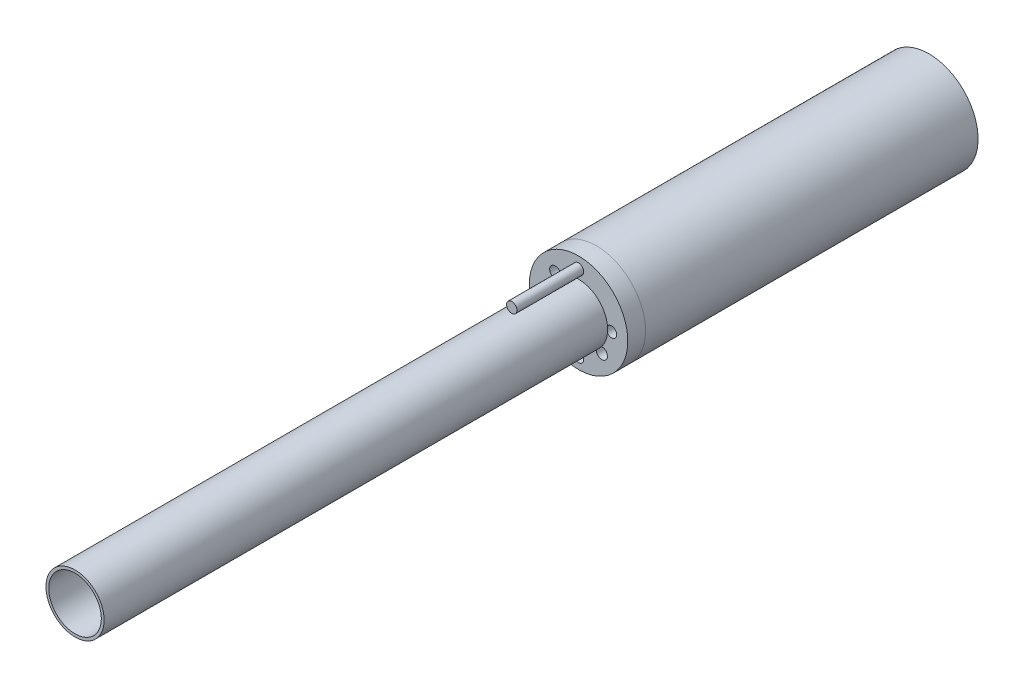
ISO-10303-21;
HEADER;
FILE_DESCRIPTION(('STEP AP214'),'2;1');
FILE_NAME('part.step','',(''),(''),'','','');
FILE_SCHEMA(('AUTOMOTIVE_DESIGN { 1 0 10303 214 1 1 1 1 }'));
ENDSEC;
DATA;
#1=APPLICATION_CONTEXT('core data for automotive mechanical design processes');
#2=APPLICATION_PROTOCOL_DEFINITION('international standard','automotive_design',2000,#1);
#3=PRODUCT_CONTEXT('',#1,'mechanical');
#4=PRODUCT('Part','Part','',(#3));
#5=PRODUCT_RELATED_PRODUCT_CATEGORY('part','',(#4));
#6=PRODUCT_DEFINITION_FORMATION('','',#4);
#7=PRODUCT_DEFINITION_CONTEXT('part definition',#1,'design');
#8=PRODUCT_DEFINITION('design','',#6,#7);
#9=PRODUCT_DEFINITION_SHAPE('','',#8);
#10=(LENGTH_UNIT() NAMED_UNIT(*) SI_UNIT(.MILLI.,.METRE.));
#11=(NAMED_UNIT(*) PLANE_ANGLE_UNIT() SI_UNIT($,.RADIAN.));
#12=(NAMED_UNIT(*) SI_UNIT($,.STERADIAN.) SOLID_ANGLE_UNIT());
#13=UNCERTAINTY_MEASURE_WITH_UNIT(LENGTH_MEASURE(1.E-05),#10,'distance_accuracy_value','');
#14=(GEOMETRIC_REPRESENTATION_CONTEXT(3) GLOBAL_UNCERTAINTY_ASSIGNED_CONTEXT((#13)) GLOBAL_UNIT_ASSIGNED_CONTEXT((#10,
#11,#12)) REPRESENTATION_CONTEXT('',''));
#15=CARTESIAN_POINT('',(0.,0.,0.));
#16=DIRECTION('',(0.,0.,1.));
#17=DIRECTION('',(1.,0.,0.));
#18=AXIS2_PLACEMENT_3D('',#15,#16,#17);
#19=CARTESIAN_POINT('',(0.,0.,3.175));
#20=DIRECTION('',(0.,0.,1.));
#21=DIRECTION('',(1.,0.,0.));
#22=AXIS2_PLACEMENT_3D('',#19,#20,#21);
#23=CYLINDRICAL_SURFACE('',#22,4.7);
#24=CARTESIAN_POINT('',(0.,0.,3.175));
#25=DIRECTION('',(0.,0.,1.));
#26=DIRECTION('',(1.,0.,0.));
#27=AXIS2_PLACEMENT_3D('',#24,#25,#26);
#28=CIRCLE('',#27,4.7);
#29=CARTESIAN_POINT('',(4.7,0.,3.175));
#30=VERTEX_POINT('',#29);
#31=EDGE_CURVE('P0_E44',#30,#30,#28,.T.);
#32=ORIENTED_EDGE('',*,*,#31,.F.);
#33=EDGE_LOOP('',(#32));
#34=FACE_BOUND('',#33,.T.);
#35=CARTESIAN_POINT('',(0.,0.,93.175));
#36=DIRECTION('',(0.,0.,1.));
#37=DIRECTION('',(1.,0.,0.));
#38=AXIS2_PLACEMENT_3D('',#35,#36,#37);
#39=CIRCLE('',#38,4.7);
#40=CARTESIAN_POINT('',(4.7,0.,93.175));
#41=VERTEX_POINT('',#40);
#42=EDGE_CURVE('P0_E52',#41,#41,#39,.T.);
#43=ORIENTED_EDGE('',*,*,#42,.T.);
#44=EDGE_LOOP('',(#43));
#45=FACE_BOUND('',#44,.T.);
#46=ADVANCED_FACE('P0_F38',(#34,#45),#23,.F.);
#47=CARTESIAN_POINT('',(0.,0.,3.175));
#48=DIRECTION('',(0.,0.,1.));
#49=DIRECTION('',(1.,0.,0.));
#50=AXIS2_PLACEMENT_3D('',#47,#48,#49);
#51=CYLINDRICAL_SURFACE('',#50,5.2);
#52=CARTESIAN_POINT('',(0.,0.,3.175));
#53=DIRECTION('',(0.,0.,1.));
#54=DIRECTION('',(1.,0.,0.));
#55=AXIS2_PLACEMENT_3D('',#52,#53,#54);
#56=CIRCLE('',#55,5.2);
#57=CARTESIAN_POINT('',(5.2,0.,3.175));
#58=VERTEX_POINT('',#57);
#59=EDGE_CURVE('P0_E10',#58,#58,#56,.T.);
#60=ORIENTED_EDGE('',*,*,#59,.T.);
#61=EDGE_LOOP('',(#60));
#62=FACE_BOUND('',#61,.T.);
#63=CARTESIAN_POINT('',(0.,0.,93.175));
#64=DIRECTION('',(0.,0.,1.));
#65=DIRECTION('',(1.,0.,0.));
#66=AXIS2_PLACEMENT_3D('',#63,#64,#65);
#67=CIRCLE('',#66,5.2);
#68=CARTESIAN_POINT('',(5.2,0.,93.175));
#69=VERTEX_POINT('',#68);
#70=EDGE_CURVE('P0_E48',#69,#69,#67,.T.);
#71=ORIENTED_EDGE('',*,*,#70,.F.);
#72=EDGE_LOOP('',(#71));
#73=FACE_BOUND('',#72,.T.);
#74=ADVANCED_FACE('P0_F66',(#62,#73),#51,.T.);
#75=CARTESIAN_POINT('',(0.,0.,3.175));
#76=DIRECTION('',(0.,0.,1.));
#77=DIRECTION('',(1.,0.,0.));
#78=AXIS2_PLACEMENT_3D('',#75,#76,#77);
#79=PLANE('',#78);
#80=ORIENTED_EDGE('',*,*,#31,.T.);
#81=EDGE_LOOP('',(#80));
#82=FACE_BOUND('',#81,.T.);
#83=ORIENTED_EDGE('',*,*,#59,.F.);
#84=EDGE_LOOP('',(#83));
#85=FACE_BOUND('',#84,.T.);
#86=ADVANCED_FACE('P0_F62',(#82,#85),#79,.F.);
#87=CARTESIAN_POINT('',(0.,0.,93.175));
#88=DIRECTION('',(0.,0.,1.));
#89=DIRECTION('',(1.,0.,0.));
#90=AXIS2_PLACEMENT_3D('',#87,#88,#89);
#91=PLANE('',#90);
#92=ORIENTED_EDGE('',*,*,#42,.F.);
#93=EDGE_LOOP('',(#92));
#94=FACE_BOUND('',#93,.T.);
#95=ORIENTED_EDGE('',*,*,#70,.T.);
#96=EDGE_LOOP('',(#95));
#97=FACE_BOUND('',#96,.T.);
#98=ADVANCED_FACE('P0_F59',(#94,#97),#91,.T.);
#99=CLOSED_SHELL('',(#46,#74,#86,#98));
#100=MANIFOLD_SOLID_BREP('P0_B2',#99);
#101=CARTESIAN_POINT('',(0.,0.,3.175));
#102=DIRECTION('',(0.,0.,1.));
#103=DIRECTION('',(-1.,0.,0.));
#104=AXIS2_PLACEMENT_3D('',#101,#102,#103);
#105=CYLINDRICAL_SURFACE('',#104,4.5);
#106=CARTESIAN_POINT('',(0.,0.,13.175));
#107=DIRECTION('',(0.,0.,1.));
#108=DIRECTION('',(-1.,0.,0.));
#109=AXIS2_PLACEMENT_3D('',#106,#107,#108);
#110=CIRCLE('',#109,4.5);
#111=CARTESIAN_POINT('',(4.5,0.,13.175));
#112=VERTEX_POINT('',#111);
#113=EDGE_CURVE('P1_E27',#112,#112,#110,.T.);
#114=ORIENTED_EDGE('',*,*,#113,.F.);
#115=DIRECTION('',(0.,0.,-1.));
#116=VECTOR('',#115,1.);
#117=CARTESIAN_POINT('',(4.5,0.,3.175));
#118=LINE('',#117,#116);
#119=CARTESIAN_POINT('',(4.5,0.,3.175));
#120=VERTEX_POINT('',#119);
#121=EDGE_CURVE('P1_E11',#112,#120,#118,.T.);
#122=ORIENTED_EDGE('',*,*,#121,.T.);
#123=CARTESIAN_POINT('',(0.,0.,3.175));
#124=DIRECTION('',(0.,0.,-1.));
#125=DIRECTION('',(-1.,0.,0.));
#126=AXIS2_PLACEMENT_3D('',#123,#124,#125);
#127=CIRCLE('',#126,4.5);
#128=EDGE_CURVE('P1_E120',#120,#120,#127,.T.);
#129=ORIENTED_EDGE('',*,*,#128,.F.);
#130=ORIENTED_EDGE('',*,*,#121,.F.);
#131=EDGE_LOOP('',(#114,#122,#129,#130));
#132=FACE_BOUND('',#131,.T.);
#133=ADVANCED_FACE('P1_F16',(#132),#105,.T.);
#134=CARTESIAN_POINT('',(0.,0.,13.175));
#135=DIRECTION('',(0.,0.,1.));
#136=DIRECTION('',(1.,0.,0.));
#137=AXIS2_PLACEMENT_3D('',#134,#135,#136);
#138=PLANE('',#137);
#139=ORIENTED_EDGE('',*,*,#113,.T.);
#140=EDGE_LOOP('',(#139));
#141=FACE_BOUND('',#140,.T.);
#142=ADVANCED_FACE('P1_F229',(#141),#138,.T.);
#143=CARTESIAN_POINT('',(4.16683884017609,-4.16683884017609,0.));
#144=DIRECTION('',(0.,0.,1.));
#145=DIRECTION('',(1.,0.,0.));
#146=AXIS2_PLACEMENT_3D('',#143,#144,#145);
#147=CYLINDRICAL_SURFACE('',#146,1.);
#148=CARTESIAN_POINT('',(4.16683884017609,-4.16683884017609,3.175));
#149=DIRECTION('',(0.,0.,-1.));
#150=DIRECTION('',(1.,0.,0.));
#151=AXIS2_PLACEMENT_3D('',#148,#149,#150);
#152=CIRCLE('',#151,1.);
#153=CARTESIAN_POINT('',(3.16683884017609,-4.16683884017609,3.175));
#154=VERTEX_POINT('',#153);
#155=EDGE_CURVE('P1_E92',#154,#154,#152,.T.);
#156=ORIENTED_EDGE('',*,*,#155,.F.);
#157=DIRECTION('',(0.,0.,-1.));
#158=VECTOR('',#157,1.);
#159=CARTESIAN_POINT('',(3.16683884017609,-4.16683884017609,0.));
#160=LINE('',#159,#158);
#161=CARTESIAN_POINT('',(3.16683884017609,-4.16683884017609,0.));
#162=VERTEX_POINT('',#161);
#163=EDGE_CURVE('P1_E87',#154,#162,#160,.T.);
#164=ORIENTED_EDGE('',*,*,#163,.T.);
#165=CARTESIAN_POINT('',(4.16683884017609,-4.16683884017609,0.));
#166=DIRECTION('',(0.,0.,-1.));
#167=DIRECTION('',(1.,0.,0.));
#168=AXIS2_PLACEMENT_3D('',#165,#166,#167);
#169=CIRCLE('',#168,1.);
#170=EDGE_CURVE('P1_E81',#162,#162,#169,.T.);
#171=ORIENTED_EDGE('',*,*,#170,.T.);
#172=ORIENTED_EDGE('',*,*,#163,.F.);
#173=EDGE_LOOP('',(#156,#164,#171,#172));
#174=FACE_BOUND('',#173,.T.);
#175=ADVANCED_FACE('P1_F90',(#174),#147,.F.);
#176=CARTESIAN_POINT('',(-4.16683884017609,4.16683884017609,0.));
#177=DIRECTION('',(0.,0.,1.));
#178=DIRECTION('',(1.,0.,0.));
#179=AXIS2_PLACEMENT_3D('',#176,#177,#178);
#180=CYLINDRICAL_SURFACE('',#179,1.);
#181=CARTESIAN_POINT('',(-4.16683884017609,4.16683884017609,3.175));
#182=DIRECTION('',(0.,0.,-1.));
#183=DIRECTION('',(1.,0.,0.));
#184=AXIS2_PLACEMENT_3D('',#181,#182,#183);
#185=CIRCLE('',#184,1.);
#186=CARTESIAN_POINT('',(-5.16683884017609,4.16683884017609,3.175));
#187=VERTEX_POINT('',#186);
#188=EDGE_CURVE('P1_E111',#187,#187,#185,.T.);
#189=ORIENTED_EDGE('',*,*,#188,.F.);
#190=DIRECTION('',(0.,0.,-1.));
#191=VECTOR('',#190,1.);
#192=CARTESIAN_POINT('',(-5.16683884017609,4.16683884017609,0.));
#193=LINE('',#192,#191);
#194=CARTESIAN_POINT('',(-5.16683884017609,4.16683884017609,0.));
#195=VERTEX_POINT('',#194);
#196=EDGE_CURVE('P1_E88',#187,#195,#193,.T.);
#197=ORIENTED_EDGE('',*,*,#196,.T.);
#198=CARTESIAN_POINT('',(-4.16683884017609,4.16683884017609,0.));
#199=DIRECTION('',(0.,0.,-1.));
#200=DIRECTION('',(1.,0.,0.));
#201=AXIS2_PLACEMENT_3D('',#198,#199,#200);
#202=CIRCLE('',#201,1.);
#203=EDGE_CURVE('P1_E129',#195,#195,#202,.T.);
#204=ORIENTED_EDGE('',*,*,#203,.T.);
#205=ORIENTED_EDGE('',*,*,#196,.F.);
#206=EDGE_LOOP('',(#189,#197,#204,#205));
#207=FACE_BOUND('',#206,.T.);
#208=ADVANCED_FACE('P1_F228',(#207),#180,.F.);
#209=CARTESIAN_POINT('',(5.8928,0.,0.));
#210=DIRECTION('',(0.,0.,1.));
#211=DIRECTION('',(1.,0.,0.));
#212=AXIS2_PLACEMENT_3D('',#209,#210,#211);
#213=CYLINDRICAL_SURFACE('',#212,0.927);
#214=CARTESIAN_POINT('',(5.8928,0.,3.175));
#215=DIRECTION('',(0.,0.,-1.));
#216=DIRECTION('',(1.,0.,0.));
#217=AXIS2_PLACEMENT_3D('',#214,#215,#216);
#218=CIRCLE('',#217,0.927);
#219=CARTESIAN_POINT('',(4.9658,0.,3.175));
#220=VERTEX_POINT('',#219);
#221=EDGE_CURVE('P1_E115',#220,#220,#218,.T.);
#222=ORIENTED_EDGE('',*,*,#221,.F.);
#223=DIRECTION('',(0.,0.,-1.));
#224=VECTOR('',#223,1.);
#225=CARTESIAN_POINT('',(4.9658,0.,0.));
#226=LINE('',#225,#224);
#227=CARTESIAN_POINT('',(4.9658,0.,0.));
#228=VERTEX_POINT('',#227);
#229=EDGE_CURVE('P1_E103',#220,#228,#226,.T.);
#230=ORIENTED_EDGE('',*,*,#229,.T.);
#231=CARTESIAN_POINT('',(5.8928,0.,0.));
#232=DIRECTION('',(0.,0.,-1.));
#233=DIRECTION('',(1.,0.,0.));
#234=AXIS2_PLACEMENT_3D('',#231,#232,#233);
#235=CIRCLE('',#234,0.927);
#236=EDGE_CURVE('P1_E100',#228,#228,#235,.T.);
#237=ORIENTED_EDGE('',*,*,#236,.T.);
#238=ORIENTED_EDGE('',*,*,#229,.F.);
#239=EDGE_LOOP('',(#222,#230,#237,#238));
#240=FACE_BOUND('',#239,.T.);
#241=ADVANCED_FACE('P1_F239',(#240),#213,.F.);
#242=CARTESIAN_POINT('',(-5.8928,0.,0.));
#243=DIRECTION('',(0.,0.,1.));
#244=DIRECTION('',(1.,0.,0.));
#245=AXIS2_PLACEMENT_3D('',#242,#243,#244);
#246=CYLINDRICAL_SURFACE('',#245,0.927);
#247=CARTESIAN_POINT('',(-5.8928,0.,3.175));
#248=DIRECTION('',(0.,0.,-1.));
#249=DIRECTION('',(1.,0.,0.));
#250=AXIS2_PLACEMENT_3D('',#247,#248,#249);
#251=CIRCLE('',#250,0.927);
#252=CARTESIAN_POINT('',(-6.8198,0.,3.175));
#253=VERTEX_POINT('',#252);
#254=EDGE_CURVE('P1_E135',#253,#253,#251,.T.);
#255=ORIENTED_EDGE('',*,*,#254,.F.);
#256=DIRECTION('',(0.,0.,-1.));
#257=VECTOR('',#256,1.);
#258=CARTESIAN_POINT('',(-6.8198,0.,0.));
#259=LINE('',#258,#257);
#260=CARTESIAN_POINT('',(-6.8198,0.,0.));
#261=VERTEX_POINT('',#260);
#262=EDGE_CURVE('P1_E104',#253,#261,#259,.T.);
#263=ORIENTED_EDGE('',*,*,#262,.T.);
#264=CARTESIAN_POINT('',(-5.8928,0.,0.));
#265=DIRECTION('',(0.,0.,-1.));
#266=DIRECTION('',(1.,0.,0.));
#267=AXIS2_PLACEMENT_3D('',#264,#265,#266);
#268=CIRCLE('',#267,0.927);
#269=EDGE_CURVE('P1_E131',#261,#261,#268,.T.);
#270=ORIENTED_EDGE('',*,*,#269,.T.);
#271=ORIENTED_EDGE('',*,*,#262,.F.);
#272=EDGE_LOOP('',(#255,#263,#270,#271));
#273=FACE_BOUND('',#272,.T.);
#274=ADVANCED_FACE('P1_F18',(#273),#246,.F.);
#275=CARTESIAN_POINT('',(0.,-6.7945,0.));
#276=DIRECTION('',(0.,0.,1.));
#277=DIRECTION('',(1.,0.,0.));
#278=AXIS2_PLACEMENT_3D('',#275,#276,#277);
#279=CYLINDRICAL_SURFACE('',#278,0.927);
#280=CARTESIAN_POINT('',(0.,-6.7945,3.175));
#281=DIRECTION('',(0.,0.,-1.));
#282=DIRECTION('',(1.,0.,0.));
#283=AXIS2_PLACEMENT_3D('',#280,#281,#282);
#284=CIRCLE('',#283,0.927);
#285=CARTESIAN_POINT('',(-0.927,-6.7945,3.175));
#286=VERTEX_POINT('',#285);
#287=EDGE_CURVE('P1_E121',#286,#286,#284,.T.);
#288=ORIENTED_EDGE('',*,*,#287,.F.);
#289=DIRECTION('',(0.,0.,-1.));
#290=VECTOR('',#289,1.);
#291=CARTESIAN_POINT('',(-0.927,-6.7945,0.));
#292=LINE('',#291,#290);
#293=CARTESIAN_POINT('',(-0.927,-6.7945,0.));
#294=VERTEX_POINT('',#293);
#295=EDGE_CURVE('P1_E20',#286,#294,#292,.T.);
#296=ORIENTED_EDGE('',*,*,#295,.T.);
#297=CARTESIAN_POINT('',(0.,-6.7945,0.));
#298=DIRECTION('',(0.,0.,-1.));
#299=DIRECTION('',(1.,0.,0.));
#300=AXIS2_PLACEMENT_3D('',#297,#298,#299);
#301=CIRCLE('',#300,0.927);
#302=EDGE_CURVE('P1_E145',#294,#294,#301,.T.);
#303=ORIENTED_EDGE('',*,*,#302,.T.);
#304=ORIENTED_EDGE('',*,*,#295,.F.);
#305=EDGE_LOOP('',(#288,#296,#303,#304));
#306=FACE_BOUND('',#305,.T.);
#307=ADVANCED_FACE('P1_F195',(#306),#279,.F.);
#308=CARTESIAN_POINT('',(0.,6.7945,0.));
#309=DIRECTION('',(0.,0.,1.));
#310=DIRECTION('',(1.,0.,0.));
#311=AXIS2_PLACEMENT_3D('',#308,#309,#310);
#312=CYLINDRICAL_SURFACE('',#311,0.927);
#313=CARTESIAN_POINT('',(0.,6.7945,3.175));
#314=DIRECTION('',(0.,0.,-1.));
#315=DIRECTION('',(1.,0.,0.));
#316=AXIS2_PLACEMENT_3D('',#313,#314,#315);
#317=CIRCLE('',#316,0.927);
#318=CARTESIAN_POINT('',(-0.927,6.7945,3.175));
#319=VERTEX_POINT('',#318);
#320=EDGE_CURVE('P1_E116',#319,#319,#317,.T.);
#321=ORIENTED_EDGE('',*,*,#320,.F.);
#322=DIRECTION('',(0.,0.,-1.));
#323=VECTOR('',#322,1.);
#324=CARTESIAN_POINT('',(-0.927,6.7945,0.));
#325=LINE('',#324,#323);
#326=CARTESIAN_POINT('',(-0.927,6.7945,0.));
#327=VERTEX_POINT('',#326);
#328=EDGE_CURVE('P1_E108',#319,#327,#325,.T.);
#329=ORIENTED_EDGE('',*,*,#328,.T.);
#330=CARTESIAN_POINT('',(0.,6.7945,0.));
#331=DIRECTION('',(0.,0.,-1.));
#332=DIRECTION('',(1.,0.,0.));
#333=AXIS2_PLACEMENT_3D('',#330,#331,#332);
#334=CIRCLE('',#333,0.927);
#335=EDGE_CURVE('P1_E105',#327,#327,#334,.T.);
#336=ORIENTED_EDGE('',*,*,#335,.T.);
#337=ORIENTED_EDGE('',*,*,#328,.F.);
#338=EDGE_LOOP('',(#321,#329,#336,#337));
#339=FACE_BOUND('',#338,.T.);
#340=ADVANCED_FACE('P1_F206',(#339),#312,.F.);
#341=CARTESIAN_POINT('',(0.,0.,0.));
#342=DIRECTION('',(0.,0.,1.));
#343=DIRECTION('',(1.,0.,0.));
#344=AXIS2_PLACEMENT_3D('',#341,#342,#343);
#345=CYLINDRICAL_SURFACE('',#344,8.8011);
#346=CARTESIAN_POINT('',(0.,0.,3.175));
#347=DIRECTION('',(0.,0.,1.));
#348=DIRECTION('',(1.,0.,0.));
#349=AXIS2_PLACEMENT_3D('',#346,#347,#348);
#350=CIRCLE('',#349,8.8011);
#351=CARTESIAN_POINT('',(-8.8011,0.,3.175));
#352=VERTEX_POINT('',#351);
#353=EDGE_CURVE('P1_E122',#352,#352,#350,.T.);
#354=ORIENTED_EDGE('',*,*,#353,.F.);
#355=DIRECTION('',(0.,0.,-1.));
#356=VECTOR('',#355,1.);
#357=CARTESIAN_POINT('',(-8.8011,0.,0.));
#358=LINE('',#357,#356);
#359=CARTESIAN_POINT('',(-8.8011,0.,0.));
#360=VERTEX_POINT('',#359);
#361=EDGE_CURVE('P1_E109',#352,#360,#358,.T.);
#362=ORIENTED_EDGE('',*,*,#361,.T.);
#363=CARTESIAN_POINT('',(0.,0.,0.));
#364=DIRECTION('',(0.,0.,1.));
#365=DIRECTION('',(1.,0.,0.));
#366=AXIS2_PLACEMENT_3D('',#363,#364,#365);
#367=CIRCLE('',#366,8.8011);
#368=EDGE_CURVE('P1_E126',#360,#360,#367,.T.);
#369=ORIENTED_EDGE('',*,*,#368,.T.);
#370=ORIENTED_EDGE('',*,*,#361,.F.);
#371=EDGE_LOOP('',(#354,#362,#369,#370));
#372=FACE_BOUND('',#371,.T.);
#373=ADVANCED_FACE('P1_F200',(#372),#345,.T.);
#374=CARTESIAN_POINT('',(0.,0.,3.175));
#375=DIRECTION('',(0.,0.,1.));
#376=DIRECTION('',(1.,0.,0.));
#377=AXIS2_PLACEMENT_3D('',#374,#375,#376);
#378=PLANE('',#377);
#379=ORIENTED_EDGE('',*,*,#353,.T.);
#380=EDGE_LOOP('',(#379));
#381=FACE_BOUND('',#380,.T.);
#382=ORIENTED_EDGE('',*,*,#128,.T.);
#383=EDGE_LOOP('',(#382));
#384=FACE_BOUND('',#383,.T.);
#385=ORIENTED_EDGE('',*,*,#320,.T.);
#386=EDGE_LOOP('',(#385));
#387=FACE_BOUND('',#386,.T.);
#388=ORIENTED_EDGE('',*,*,#287,.T.);
#389=EDGE_LOOP('',(#388));
#390=FACE_BOUND('',#389,.T.);
#391=ORIENTED_EDGE('',*,*,#254,.T.);
#392=EDGE_LOOP('',(#391));
#393=FACE_BOUND('',#392,.T.);
#394=ORIENTED_EDGE('',*,*,#221,.T.);
#395=EDGE_LOOP('',(#394));
#396=FACE_BOUND('',#395,.T.);
#397=ORIENTED_EDGE('',*,*,#188,.T.);
#398=EDGE_LOOP('',(#397));
#399=FACE_BOUND('',#398,.T.);
#400=ORIENTED_EDGE('',*,*,#155,.T.);
#401=EDGE_LOOP('',(#400));
#402=FACE_BOUND('',#401,.T.);
#403=ADVANCED_FACE('P1_F205',(#381,#384,#387,#390,#393,#396,#399,#402),#378,.T.);
#404=CARTESIAN_POINT('',(0.,0.,0.));
#405=DIRECTION('',(0.,0.,1.));
#406=DIRECTION('',(1.,0.,0.));
#407=AXIS2_PLACEMENT_3D('',#404,#405,#406);
#408=PLANE('',#407);
#409=ORIENTED_EDGE('',*,*,#368,.F.);
#410=EDGE_LOOP('',(#409));
#411=FACE_BOUND('',#410,.T.);
#412=ORIENTED_EDGE('',*,*,#335,.F.);
#413=EDGE_LOOP('',(#412));
#414=FACE_BOUND('',#413,.T.);
#415=ORIENTED_EDGE('',*,*,#302,.F.);
#416=EDGE_LOOP('',(#415));
#417=FACE_BOUND('',#416,.T.);
#418=ORIENTED_EDGE('',*,*,#269,.F.);
#419=EDGE_LOOP('',(#418));
#420=FACE_BOUND('',#419,.T.);
#421=ORIENTED_EDGE('',*,*,#236,.F.);
#422=EDGE_LOOP('',(#421));
#423=FACE_BOUND('',#422,.T.);
#424=ORIENTED_EDGE('',*,*,#203,.F.);
#425=EDGE_LOOP('',(#424));
#426=FACE_BOUND('',#425,.T.);
#427=ORIENTED_EDGE('',*,*,#170,.F.);
#428=EDGE_LOOP('',(#427));
#429=FACE_BOUND('',#428,.T.);
#430=ADVANCED_FACE('P1_F83',(#411,#414,#417,#420,#423,#426,#429),#408,.F.);
#431=CLOSED_SHELL('',(#133,#142,#175,#208,#241,#274,#307,#340,#373,#403,#430));
#432=MANIFOLD_SOLID_BREP('P1_B1',#431);
#433=CARTESIAN_POINT('',(0.,6.7945,3.175));
#434=DIRECTION('',(0.,0.,1.));
#435=DIRECTION('',(-1.,0.,0.));
#436=AXIS2_PLACEMENT_3D('',#433,#434,#435);
#437=CYLINDRICAL_SURFACE('',#436,0.927);
#438=CARTESIAN_POINT('',(0.,6.7945,15.113));
#439=DIRECTION('',(0.,0.,1.));
#440=DIRECTION('',(-1.,0.,0.));
#441=AXIS2_PLACEMENT_3D('',#438,#439,#440);
#442=CIRCLE('',#441,0.927);
#443=CARTESIAN_POINT('',(0.927,6.7945,15.113));
#444=VERTEX_POINT('',#443);
#445=EDGE_CURVE('P2_E36',#444,#444,#442,.T.);
#446=ORIENTED_EDGE('',*,*,#445,.F.);
#447=DIRECTION('',(0.,0.,-1.));
#448=VECTOR('',#447,1.);
#449=CARTESIAN_POINT('',(0.927,6.7945,3.175));
#450=LINE('',#449,#448);
#451=CARTESIAN_POINT('',(0.927,6.7945,3.175));
#452=VERTEX_POINT('',#451);
#453=EDGE_CURVE('P2_E11',#444,#452,#450,.T.);
#454=ORIENTED_EDGE('',*,*,#453,.T.);
#455=CARTESIAN_POINT('',(0.,6.7945,3.175));
#456=DIRECTION('',(0.,0.,1.));
#457=DIRECTION('',(-1.,0.,0.));
#458=AXIS2_PLACEMENT_3D('',#455,#456,#457);
#459=CIRCLE('',#458,0.927);
#460=EDGE_CURVE('P2_E20',#452,#452,#459,.T.);
#461=ORIENTED_EDGE('',*,*,#460,.T.);
#462=ORIENTED_EDGE('',*,*,#453,.F.);
#463=EDGE_LOOP('',(#446,#454,#461,#462));
#464=FACE_BOUND('',#463,.T.);
#465=ADVANCED_FACE('P2_F16',(#464),#437,.T.);
#466=CARTESIAN_POINT('',(0.,6.7945,15.113));
#467=DIRECTION('',(0.,0.,1.));
#468=DIRECTION('',(1.,0.,0.));
#469=AXIS2_PLACEMENT_3D('',#466,#467,#468);
#470=PLANE('',#469);
#471=ORIENTED_EDGE('',*,*,#445,.T.);
#472=EDGE_LOOP('',(#471));
#473=FACE_BOUND('',#472,.T.);
#474=ADVANCED_FACE('P2_F18',(#473),#470,.T.);
#475=CARTESIAN_POINT('',(0.,6.7945,3.175));
#476=DIRECTION('',(0.,0.,1.));
#477=DIRECTION('',(1.,0.,0.));
#478=AXIS2_PLACEMENT_3D('',#475,#476,#477);
#479=PLANE('',#478);
#480=ORIENTED_EDGE('',*,*,#460,.F.);
#481=EDGE_LOOP('',(#480));
#482=FACE_BOUND('',#481,.T.);
#483=ADVANCED_FACE('P2_F42',(#482),#479,.F.);
#484=CLOSED_SHELL('',(#465,#474,#483));
#485=MANIFOLD_SOLID_BREP('P2_B1',#484);
#486=CARTESIAN_POINT('',(0.,0.,0.));
#487=DIRECTION('',(0.,0.,-1.));
#488=DIRECTION('',(1.,0.,0.));
#489=AXIS2_PLACEMENT_3D('',#486,#487,#488);
#490=CYLINDRICAL_SURFACE('',#489,8.8011);
#491=CARTESIAN_POINT('',(0.,0.,-59.436));
#492=DIRECTION('',(0.,0.,-1.));
#493=DIRECTION('',(1.,0.,0.));
#494=AXIS2_PLACEMENT_3D('',#491,#492,#493);
#495=CIRCLE('',#494,8.8011);
#496=CARTESIAN_POINT('',(-8.8011,0.,-59.436));
#497=VERTEX_POINT('',#496);
#498=EDGE_CURVE('P3_E19',#497,#497,#495,.T.);
#499=ORIENTED_EDGE('',*,*,#498,.F.);
#500=DIRECTION('',(0.,0.,1.));
#501=VECTOR('',#500,1.);
#502=CARTESIAN_POINT('',(-8.8011,0.,0.));
#503=LINE('',#502,#501);
#504=CARTESIAN_POINT('',(-8.8011,0.,0.));
#505=VERTEX_POINT('',#504);
#506=EDGE_CURVE('P3_E11',#497,#505,#503,.T.);
#507=ORIENTED_EDGE('',*,*,#506,.T.);
#508=CARTESIAN_POINT('',(0.,0.,0.));
#509=DIRECTION('',(0.,0.,-1.));
#510=DIRECTION('',(1.,0.,0.));
#511=AXIS2_PLACEMENT_3D('',#508,#509,#510);
#512=CIRCLE('',#511,8.8011);
#513=EDGE_CURVE('P3_E25',#505,#505,#512,.T.);
#514=ORIENTED_EDGE('',*,*,#513,.T.);
#515=ORIENTED_EDGE('',*,*,#506,.F.);
#516=EDGE_LOOP('',(#499,#507,#514,#515));
#517=FACE_BOUND('',#516,.T.);
#518=ADVANCED_FACE('P3_F16',(#517),#490,.T.);
#519=CARTESIAN_POINT('',(0.,0.,-59.436));
#520=DIRECTION('',(0.,0.,-1.));
#521=DIRECTION('',(0.,-1.,0.));
#522=AXIS2_PLACEMENT_3D('',#519,#520,#521);
#523=PLANE('',#522);
#524=ORIENTED_EDGE('',*,*,#498,.T.);
#525=EDGE_LOOP('',(#524));
#526=FACE_BOUND('',#525,.T.);
#527=ADVANCED_FACE('P3_F45',(#526),#523,.T.);
#528=CARTESIAN_POINT('',(0.,0.,0.));
#529=DIRECTION('',(0.,0.,-1.));
#530=DIRECTION('',(0.,-1.,0.));
#531=AXIS2_PLACEMENT_3D('',#528,#529,#530);
#532=PLANE('',#531);
#533=ORIENTED_EDGE('',*,*,#513,.F.);
#534=EDGE_LOOP('',(#533));
#535=FACE_BOUND('',#534,.T.);
#536=ADVANCED_FACE('P3_F41',(#535),#532,.F.);
#537=CLOSED_SHELL('',(#518,#527,#536));
#538=MANIFOLD_SOLID_BREP('P3_B1',#537);
#539=ADVANCED_BREP_SHAPE_REPRESENTATION('',(#18,#100,#432,#485,#538),#14);
#540=SHAPE_DEFINITION_REPRESENTATION(#9,#539);
ENDSEC;
END-ISO-10303-21;
